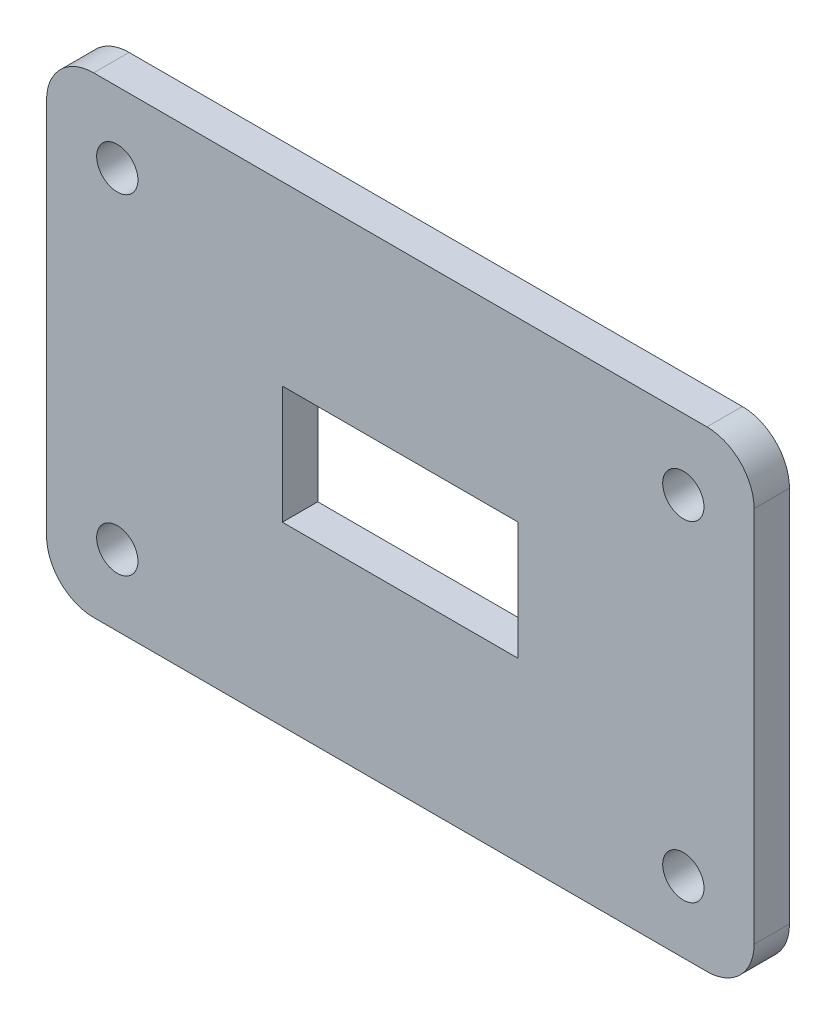
ISO-10303-21;
HEADER;
FILE_DESCRIPTION(('STEP AP214'),'2;1');
FILE_NAME('part.step','',(''),(''),'','','');
FILE_SCHEMA(('AUTOMOTIVE_DESIGN { 1 0 10303 214 1 1 1 1 }'));
ENDSEC;
DATA;
#1=APPLICATION_CONTEXT('core data for automotive mechanical design processes');
#2=APPLICATION_PROTOCOL_DEFINITION('international standard','automotive_design',2000,#1);
#3=PRODUCT_CONTEXT('',#1,'mechanical');
#4=PRODUCT('Part','Part','',(#3));
#5=PRODUCT_RELATED_PRODUCT_CATEGORY('part','',(#4));
#6=PRODUCT_DEFINITION_FORMATION('','',#4);
#7=PRODUCT_DEFINITION_CONTEXT('part definition',#1,'design');
#8=PRODUCT_DEFINITION('design','',#6,#7);
#9=PRODUCT_DEFINITION_SHAPE('','',#8);
#10=(LENGTH_UNIT() NAMED_UNIT(*) SI_UNIT(.MILLI.,.METRE.));
#11=(NAMED_UNIT(*) PLANE_ANGLE_UNIT() SI_UNIT($,.RADIAN.));
#12=(NAMED_UNIT(*) SI_UNIT($,.STERADIAN.) SOLID_ANGLE_UNIT());
#13=UNCERTAINTY_MEASURE_WITH_UNIT(LENGTH_MEASURE(1.E-05),#10,'distance_accuracy_value','');
#14=(GEOMETRIC_REPRESENTATION_CONTEXT(3) GLOBAL_UNCERTAINTY_ASSIGNED_CONTEXT((#13)) GLOBAL_UNIT_ASSIGNED_CONTEXT((#10,
#11,#12)) REPRESENTATION_CONTEXT('',''));
#15=CARTESIAN_POINT('',(0.,0.,0.));
#16=DIRECTION('',(0.,0.,1.));
#17=DIRECTION('',(1.,0.,0.));
#18=AXIS2_PLACEMENT_3D('',#15,#16,#17);
#19=CARTESIAN_POINT('',(-52.,-32.,6.));
#20=DIRECTION('',(0.,0.,-1.));
#21=DIRECTION('',(-1.,0.,0.));
#22=AXIS2_PLACEMENT_3D('',#19,#20,#21);
#23=CYLINDRICAL_SURFACE('',#22,7.99999999999999);
#24=CARTESIAN_POINT('',(-52.,-32.,0.));
#25=DIRECTION('',(0.,0.,1.));
#26=DIRECTION('',(1.,0.,0.));
#27=AXIS2_PLACEMENT_3D('',#24,#25,#26);
#28=CIRCLE('',#27,7.99999999999999);
#29=CARTESIAN_POINT('',(-60.,-32.,0.));
#30=VERTEX_POINT('',#29);
#31=CARTESIAN_POINT('',(-52.,-40.,0.));
#32=VERTEX_POINT('',#31);
#33=EDGE_CURVE('E220',#30,#32,#28,.T.);
#34=ORIENTED_EDGE('',*,*,#33,.T.);
#35=DIRECTION('',(0.,0.,-1.));
#36=VECTOR('',#35,1.);
#37=CARTESIAN_POINT('',(-52.,-40.,6.));
#38=LINE('',#37,#36);
#39=CARTESIAN_POINT('',(-52.,-40.,6.));
#40=VERTEX_POINT('',#39);
#41=EDGE_CURVE('E144',#40,#32,#38,.T.);
#42=ORIENTED_EDGE('',*,*,#41,.F.);
#43=CARTESIAN_POINT('',(-52.,-32.,6.));
#44=DIRECTION('',(0.,0.,1.));
#45=DIRECTION('',(1.,0.,0.));
#46=AXIS2_PLACEMENT_3D('',#43,#44,#45);
#47=CIRCLE('',#46,7.99999999999999);
#48=CARTESIAN_POINT('',(-60.,-32.,6.));
#49=VERTEX_POINT('',#48);
#50=EDGE_CURVE('E201',#49,#40,#47,.T.);
#51=ORIENTED_EDGE('',*,*,#50,.F.);
#52=DIRECTION('',(0.,0.,-1.));
#53=VECTOR('',#52,1.);
#54=CARTESIAN_POINT('',(-60.,-32.,6.));
#55=LINE('',#54,#53);
#56=EDGE_CURVE('E194',#49,#30,#55,.T.);
#57=ORIENTED_EDGE('',*,*,#56,.T.);
#58=EDGE_LOOP('',(#34,#42,#51,#57));
#59=FACE_BOUND('',#58,.T.);
#60=ADVANCED_FACE('F51',(#59),#23,.T.);
#61=CARTESIAN_POINT('',(-52.,-40.,6.));
#62=DIRECTION('',(0.,1.,0.));
#63=DIRECTION('',(0.,0.,1.));
#64=AXIS2_PLACEMENT_3D('',#61,#62,#63);
#65=PLANE('',#64);
#66=DIRECTION('',(1.,0.,0.));
#67=VECTOR('',#66,1.);
#68=CARTESIAN_POINT('',(-52.,-40.,0.));
#69=LINE('',#68,#67);
#70=CARTESIAN_POINT('',(52.,-40.,0.));
#71=VERTEX_POINT('',#70);
#72=EDGE_CURVE('E217',#32,#71,#69,.T.);
#73=ORIENTED_EDGE('',*,*,#72,.T.);
#74=DIRECTION('',(0.,0.,-1.));
#75=VECTOR('',#74,1.);
#76=CARTESIAN_POINT('',(52.,-40.,6.));
#77=LINE('',#76,#75);
#78=CARTESIAN_POINT('',(52.,-40.,6.));
#79=VERTEX_POINT('',#78);
#80=EDGE_CURVE('E170',#79,#71,#77,.T.);
#81=ORIENTED_EDGE('',*,*,#80,.F.);
#82=DIRECTION('',(1.,0.,0.));
#83=VECTOR('',#82,1.);
#84=CARTESIAN_POINT('',(-52.,-40.,6.));
#85=LINE('',#84,#83);
#86=EDGE_CURVE('E242',#40,#79,#85,.T.);
#87=ORIENTED_EDGE('',*,*,#86,.F.);
#88=ORIENTED_EDGE('',*,*,#41,.T.);
#89=EDGE_LOOP('',(#73,#81,#87,#88));
#90=FACE_BOUND('',#89,.T.);
#91=ADVANCED_FACE('F314',(#90),#65,.F.);
#92=CARTESIAN_POINT('',(52.,-32.,6.));
#93=DIRECTION('',(0.,0.,-1.));
#94=DIRECTION('',(-1.,0.,0.));
#95=AXIS2_PLACEMENT_3D('',#92,#93,#94);
#96=CYLINDRICAL_SURFACE('',#95,7.99999999999999);
#97=CARTESIAN_POINT('',(52.,-32.,0.));
#98=DIRECTION('',(0.,0.,1.));
#99=DIRECTION('',(1.,0.,0.));
#100=AXIS2_PLACEMENT_3D('',#97,#98,#99);
#101=CIRCLE('',#100,7.99999999999999);
#102=CARTESIAN_POINT('',(60.,-32.,0.));
#103=VERTEX_POINT('',#102);
#104=EDGE_CURVE('E214',#71,#103,#101,.T.);
#105=ORIENTED_EDGE('',*,*,#104,.T.);
#106=DIRECTION('',(0.,0.,-1.));
#107=VECTOR('',#106,1.);
#108=CARTESIAN_POINT('',(60.,-32.,6.));
#109=LINE('',#108,#107);
#110=CARTESIAN_POINT('',(60.,-32.,6.));
#111=VERTEX_POINT('',#110);
#112=EDGE_CURVE('E174',#111,#103,#109,.T.);
#113=ORIENTED_EDGE('',*,*,#112,.F.);
#114=CARTESIAN_POINT('',(52.,-32.,6.));
#115=DIRECTION('',(0.,0.,1.));
#116=DIRECTION('',(1.,0.,0.));
#117=AXIS2_PLACEMENT_3D('',#114,#115,#116);
#118=CIRCLE('',#117,7.99999999999999);
#119=EDGE_CURVE('E239',#79,#111,#118,.T.);
#120=ORIENTED_EDGE('',*,*,#119,.F.);
#121=ORIENTED_EDGE('',*,*,#80,.T.);
#122=EDGE_LOOP('',(#105,#113,#120,#121));
#123=FACE_BOUND('',#122,.T.);
#124=ADVANCED_FACE('F318',(#123),#96,.T.);
#125=CARTESIAN_POINT('',(60.,-32.,6.));
#126=DIRECTION('',(-1.,0.,0.));
#127=DIRECTION('',(0.,0.,1.));
#128=AXIS2_PLACEMENT_3D('',#125,#126,#127);
#129=PLANE('',#128);
#130=DIRECTION('',(0.,1.,0.));
#131=VECTOR('',#130,1.);
#132=CARTESIAN_POINT('',(60.,-32.,0.));
#133=LINE('',#132,#131);
#134=CARTESIAN_POINT('',(60.,32.,0.));
#135=VERTEX_POINT('',#134);
#136=EDGE_CURVE('E211',#103,#135,#133,.T.);
#137=ORIENTED_EDGE('',*,*,#136,.T.);
#138=DIRECTION('',(0.,0.,-1.));
#139=VECTOR('',#138,1.);
#140=CARTESIAN_POINT('',(60.,32.,6.));
#141=LINE('',#140,#139);
#142=CARTESIAN_POINT('',(60.,32.,6.));
#143=VERTEX_POINT('',#142);
#144=EDGE_CURVE('E178',#143,#135,#141,.T.);
#145=ORIENTED_EDGE('',*,*,#144,.F.);
#146=DIRECTION('',(0.,1.,0.));
#147=VECTOR('',#146,1.);
#148=CARTESIAN_POINT('',(60.,-32.,6.));
#149=LINE('',#148,#147);
#150=EDGE_CURVE('E236',#111,#143,#149,.T.);
#151=ORIENTED_EDGE('',*,*,#150,.F.);
#152=ORIENTED_EDGE('',*,*,#112,.T.);
#153=EDGE_LOOP('',(#137,#145,#151,#152));
#154=FACE_BOUND('',#153,.T.);
#155=ADVANCED_FACE('F352',(#154),#129,.F.);
#156=CARTESIAN_POINT('',(52.,32.,6.));
#157=DIRECTION('',(0.,0.,-1.));
#158=DIRECTION('',(-1.,0.,0.));
#159=AXIS2_PLACEMENT_3D('',#156,#157,#158);
#160=CYLINDRICAL_SURFACE('',#159,7.99999999999999);
#161=CARTESIAN_POINT('',(52.,32.,0.));
#162=DIRECTION('',(0.,0.,1.));
#163=DIRECTION('',(1.,0.,0.));
#164=AXIS2_PLACEMENT_3D('',#161,#162,#163);
#165=CIRCLE('',#164,7.99999999999999);
#166=CARTESIAN_POINT('',(52.,40.,0.));
#167=VERTEX_POINT('',#166);
#168=EDGE_CURVE('E208',#135,#167,#165,.T.);
#169=ORIENTED_EDGE('',*,*,#168,.T.);
#170=DIRECTION('',(0.,0.,-1.));
#171=VECTOR('',#170,1.);
#172=CARTESIAN_POINT('',(52.,40.,6.));
#173=LINE('',#172,#171);
#174=CARTESIAN_POINT('',(52.,40.,6.));
#175=VERTEX_POINT('',#174);
#176=EDGE_CURVE('E182',#175,#167,#173,.T.);
#177=ORIENTED_EDGE('',*,*,#176,.F.);
#178=CARTESIAN_POINT('',(52.,32.,6.));
#179=DIRECTION('',(0.,0.,1.));
#180=DIRECTION('',(1.,0.,0.));
#181=AXIS2_PLACEMENT_3D('',#178,#179,#180);
#182=CIRCLE('',#181,7.99999999999999);
#183=EDGE_CURVE('E233',#143,#175,#182,.T.);
#184=ORIENTED_EDGE('',*,*,#183,.F.);
#185=ORIENTED_EDGE('',*,*,#144,.T.);
#186=EDGE_LOOP('',(#169,#177,#184,#185));
#187=FACE_BOUND('',#186,.T.);
#188=ADVANCED_FACE('F348',(#187),#160,.T.);
#189=CARTESIAN_POINT('',(52.,40.,6.));
#190=DIRECTION('',(0.,-1.,0.));
#191=DIRECTION('',(0.,0.,-1.));
#192=AXIS2_PLACEMENT_3D('',#189,#190,#191);
#193=PLANE('',#192);
#194=DIRECTION('',(-1.,0.,0.));
#195=VECTOR('',#194,1.);
#196=CARTESIAN_POINT('',(52.,40.,0.));
#197=LINE('',#196,#195);
#198=CARTESIAN_POINT('',(-52.,40.,0.));
#199=VERTEX_POINT('',#198);
#200=EDGE_CURVE('E205',#167,#199,#197,.T.);
#201=ORIENTED_EDGE('',*,*,#200,.T.);
#202=DIRECTION('',(0.,0.,-1.));
#203=VECTOR('',#202,1.);
#204=CARTESIAN_POINT('',(-52.,40.,6.));
#205=LINE('',#204,#203);
#206=CARTESIAN_POINT('',(-52.,40.,6.));
#207=VERTEX_POINT('',#206);
#208=EDGE_CURVE('E186',#207,#199,#205,.T.);
#209=ORIENTED_EDGE('',*,*,#208,.F.);
#210=DIRECTION('',(-1.,0.,0.));
#211=VECTOR('',#210,1.);
#212=CARTESIAN_POINT('',(52.,40.,6.));
#213=LINE('',#212,#211);
#214=EDGE_CURVE('E230',#175,#207,#213,.T.);
#215=ORIENTED_EDGE('',*,*,#214,.F.);
#216=ORIENTED_EDGE('',*,*,#176,.T.);
#217=EDGE_LOOP('',(#201,#209,#215,#216));
#218=FACE_BOUND('',#217,.T.);
#219=ADVANCED_FACE('F343',(#218),#193,.F.);
#220=CARTESIAN_POINT('',(-52.,32.,6.));
#221=DIRECTION('',(0.,0.,-1.));
#222=DIRECTION('',(-1.,0.,0.));
#223=AXIS2_PLACEMENT_3D('',#220,#221,#222);
#224=CYLINDRICAL_SURFACE('',#223,7.99999999999999);
#225=CARTESIAN_POINT('',(-52.,32.,0.));
#226=DIRECTION('',(0.,0.,1.));
#227=DIRECTION('',(1.,0.,0.));
#228=AXIS2_PLACEMENT_3D('',#225,#226,#227);
#229=CIRCLE('',#228,7.99999999999999);
#230=CARTESIAN_POINT('',(-60.,32.,0.));
#231=VERTEX_POINT('',#230);
#232=EDGE_CURVE('E202',#199,#231,#229,.T.);
#233=ORIENTED_EDGE('',*,*,#232,.T.);
#234=DIRECTION('',(0.,0.,-1.));
#235=VECTOR('',#234,1.);
#236=CARTESIAN_POINT('',(-60.,32.,6.));
#237=LINE('',#236,#235);
#238=CARTESIAN_POINT('',(-60.,32.,6.));
#239=VERTEX_POINT('',#238);
#240=EDGE_CURVE('E190',#239,#231,#237,.T.);
#241=ORIENTED_EDGE('',*,*,#240,.F.);
#242=CARTESIAN_POINT('',(-52.,32.,6.));
#243=DIRECTION('',(0.,0.,1.));
#244=DIRECTION('',(1.,0.,0.));
#245=AXIS2_PLACEMENT_3D('',#242,#243,#244);
#246=CIRCLE('',#245,7.99999999999999);
#247=EDGE_CURVE('E227',#207,#239,#246,.T.);
#248=ORIENTED_EDGE('',*,*,#247,.F.);
#249=ORIENTED_EDGE('',*,*,#208,.T.);
#250=EDGE_LOOP('',(#233,#241,#248,#249));
#251=FACE_BOUND('',#250,.T.);
#252=ADVANCED_FACE('F338',(#251),#224,.T.);
#253=CARTESIAN_POINT('',(-60.,32.,6.));
#254=DIRECTION('',(1.,0.,0.));
#255=DIRECTION('',(0.,0.,-1.));
#256=AXIS2_PLACEMENT_3D('',#253,#254,#255);
#257=PLANE('',#256);
#258=DIRECTION('',(0.,-1.,0.));
#259=VECTOR('',#258,1.);
#260=CARTESIAN_POINT('',(-60.,32.,0.));
#261=LINE('',#260,#259);
#262=EDGE_CURVE('E199',#231,#30,#261,.T.);
#263=ORIENTED_EDGE('',*,*,#262,.T.);
#264=ORIENTED_EDGE('',*,*,#56,.F.);
#265=DIRECTION('',(0.,-1.,0.));
#266=VECTOR('',#265,1.);
#267=CARTESIAN_POINT('',(-60.,32.,6.));
#268=LINE('',#267,#266);
#269=EDGE_CURVE('E198',#239,#49,#268,.T.);
#270=ORIENTED_EDGE('',*,*,#269,.F.);
#271=ORIENTED_EDGE('',*,*,#240,.T.);
#272=EDGE_LOOP('',(#263,#264,#270,#271));
#273=FACE_BOUND('',#272,.T.);
#274=ADVANCED_FACE('F336',(#273),#257,.F.);
#275=CARTESIAN_POINT('',(-52.,-32.,6.));
#276=DIRECTION('',(0.,0.,1.));
#277=DIRECTION('',(1.,0.,0.));
#278=AXIS2_PLACEMENT_3D('',#275,#276,#277);
#279=PLANE('',#278);
#280=DIRECTION('',(0.,-1.,0.));
#281=VECTOR('',#280,1.);
#282=CARTESIAN_POINT('',(-20.,-32.,6.));
#283=LINE('',#282,#281);
#284=CARTESIAN_POINT('',(-20.,10.,6.00000000000001));
#285=VERTEX_POINT('',#284);
#286=CARTESIAN_POINT('',(-20.,-10.,6.));
#287=VERTEX_POINT('',#286);
#288=EDGE_CURVE('E151',#285,#287,#283,.T.);
#289=ORIENTED_EDGE('',*,*,#288,.F.);
#290=DIRECTION('',(-1.,0.,0.));
#291=VECTOR('',#290,1.);
#292=CARTESIAN_POINT('',(-52.,10.,6.));
#293=LINE('',#292,#291);
#294=CARTESIAN_POINT('',(20.,10.,6.00000000000001));
#295=VERTEX_POINT('',#294);
#296=EDGE_CURVE('E280',#295,#285,#293,.T.);
#297=ORIENTED_EDGE('',*,*,#296,.F.);
#298=DIRECTION('',(0.,1.,0.));
#299=VECTOR('',#298,1.);
#300=CARTESIAN_POINT('',(20.,-32.,6.));
#301=LINE('',#300,#299);
#302=CARTESIAN_POINT('',(20.,-10.,6.00000000000001));
#303=VERTEX_POINT('',#302);
#304=EDGE_CURVE('E283',#303,#295,#301,.T.);
#305=ORIENTED_EDGE('',*,*,#304,.F.);
#306=DIRECTION('',(1.,0.,0.));
#307=VECTOR('',#306,1.);
#308=CARTESIAN_POINT('',(-52.,-10.,6.));
#309=LINE('',#308,#307);
#310=EDGE_CURVE('E286',#287,#303,#309,.T.);
#311=ORIENTED_EDGE('',*,*,#310,.F.);
#312=EDGE_LOOP('',(#289,#297,#305,#311));
#313=FACE_BOUND('',#312,.T.);
#314=CARTESIAN_POINT('',(-48.,28.,6.));
#315=DIRECTION('',(0.,0.,1.));
#316=DIRECTION('',(1.,0.,0.));
#317=AXIS2_PLACEMENT_3D('',#314,#315,#316);
#318=CIRCLE('',#317,3.5);
#319=CARTESIAN_POINT('',(-44.5,28.,6.));
#320=VERTEX_POINT('',#319);
#321=EDGE_CURVE('E265',#320,#320,#318,.T.);
#322=ORIENTED_EDGE('',*,*,#321,.F.);
#323=EDGE_LOOP('',(#322));
#324=FACE_BOUND('',#323,.T.);
#325=CARTESIAN_POINT('',(48.,-28.,6.));
#326=DIRECTION('',(0.,0.,1.));
#327=DIRECTION('',(1.,0.,0.));
#328=AXIS2_PLACEMENT_3D('',#325,#326,#327);
#329=CIRCLE('',#328,3.5);
#330=CARTESIAN_POINT('',(51.5,-28.,6.));
#331=VERTEX_POINT('',#330);
#332=EDGE_CURVE('E256',#331,#331,#329,.T.);
#333=ORIENTED_EDGE('',*,*,#332,.F.);
#334=EDGE_LOOP('',(#333));
#335=FACE_BOUND('',#334,.T.);
#336=CARTESIAN_POINT('',(48.,28.,6.));
#337=DIRECTION('',(0.,0.,1.));
#338=DIRECTION('',(1.,0.,0.));
#339=AXIS2_PLACEMENT_3D('',#336,#337,#338);
#340=CIRCLE('',#339,3.5);
#341=CARTESIAN_POINT('',(51.5,28.,6.));
#342=VERTEX_POINT('',#341);
#343=EDGE_CURVE('E272',#342,#342,#340,.T.);
#344=ORIENTED_EDGE('',*,*,#343,.F.);
#345=EDGE_LOOP('',(#344));
#346=FACE_BOUND('',#345,.T.);
#347=CARTESIAN_POINT('',(-48.,-28.,6.));
#348=DIRECTION('',(0.,0.,1.));
#349=DIRECTION('',(1.,0.,0.));
#350=AXIS2_PLACEMENT_3D('',#347,#348,#349);
#351=CIRCLE('',#350,3.5);
#352=CARTESIAN_POINT('',(-44.5,-28.,6.));
#353=VERTEX_POINT('',#352);
#354=EDGE_CURVE('E224',#353,#353,#351,.T.);
#355=ORIENTED_EDGE('',*,*,#354,.F.);
#356=EDGE_LOOP('',(#355));
#357=FACE_BOUND('',#356,.T.);
#358=ORIENTED_EDGE('',*,*,#50,.T.);
#359=ORIENTED_EDGE('',*,*,#86,.T.);
#360=ORIENTED_EDGE('',*,*,#119,.T.);
#361=ORIENTED_EDGE('',*,*,#150,.T.);
#362=ORIENTED_EDGE('',*,*,#183,.T.);
#363=ORIENTED_EDGE('',*,*,#214,.T.);
#364=ORIENTED_EDGE('',*,*,#247,.T.);
#365=ORIENTED_EDGE('',*,*,#269,.T.);
#366=EDGE_LOOP('',(#358,#359,#360,#361,#362,#363,#364,#365));
#367=FACE_BOUND('',#366,.T.);
#368=ADVANCED_FACE('F298',(#313,#324,#335,#346,#357,#367),#279,.T.);
#369=CARTESIAN_POINT('',(-52.,-32.,0.));
#370=DIRECTION('',(0.,0.,1.));
#371=DIRECTION('',(1.,0.,0.));
#372=AXIS2_PLACEMENT_3D('',#369,#370,#371);
#373=PLANE('',#372);
#374=DIRECTION('',(-1.,0.,0.));
#375=VECTOR('',#374,1.);
#376=CARTESIAN_POINT('',(-52.,10.,0.));
#377=LINE('',#376,#375);
#378=CARTESIAN_POINT('',(20.,10.,0.));
#379=VERTEX_POINT('',#378);
#380=CARTESIAN_POINT('',(-20.,10.,0.));
#381=VERTEX_POINT('',#380);
#382=EDGE_CURVE('E60',#379,#381,#377,.T.);
#383=ORIENTED_EDGE('',*,*,#382,.T.);
#384=DIRECTION('',(0.,-1.,0.));
#385=VECTOR('',#384,1.);
#386=CARTESIAN_POINT('',(-20.,-32.,0.));
#387=LINE('',#386,#385);
#388=CARTESIAN_POINT('',(-20.,-10.,0.));
#389=VERTEX_POINT('',#388);
#390=EDGE_CURVE('E11',#381,#389,#387,.T.);
#391=ORIENTED_EDGE('',*,*,#390,.T.);
#392=DIRECTION('',(1.,0.,0.));
#393=VECTOR('',#392,1.);
#394=CARTESIAN_POINT('',(-52.,-10.,0.));
#395=LINE('',#394,#393);
#396=CARTESIAN_POINT('',(20.,-10.,0.));
#397=VERTEX_POINT('',#396);
#398=EDGE_CURVE('E138',#389,#397,#395,.T.);
#399=ORIENTED_EDGE('',*,*,#398,.T.);
#400=DIRECTION('',(0.,1.,0.));
#401=VECTOR('',#400,1.);
#402=CARTESIAN_POINT('',(20.,-32.,0.));
#403=LINE('',#402,#401);
#404=EDGE_CURVE('E143',#397,#379,#403,.T.);
#405=ORIENTED_EDGE('',*,*,#404,.T.);
#406=EDGE_LOOP('',(#383,#391,#399,#405));
#407=FACE_BOUND('',#406,.T.);
#408=CARTESIAN_POINT('',(-48.,28.,0.));
#409=DIRECTION('',(0.,0.,1.));
#410=DIRECTION('',(1.,0.,0.));
#411=AXIS2_PLACEMENT_3D('',#408,#409,#410);
#412=CIRCLE('',#411,3.5);
#413=CARTESIAN_POINT('',(-44.5,28.,0.));
#414=VERTEX_POINT('',#413);
#415=EDGE_CURVE('E252',#414,#414,#412,.T.);
#416=ORIENTED_EDGE('',*,*,#415,.T.);
#417=EDGE_LOOP('',(#416));
#418=FACE_BOUND('',#417,.T.);
#419=CARTESIAN_POINT('',(48.,-28.,0.));
#420=DIRECTION('',(0.,0.,1.));
#421=DIRECTION('',(1.,0.,0.));
#422=AXIS2_PLACEMENT_3D('',#419,#420,#421);
#423=CIRCLE('',#422,3.5);
#424=CARTESIAN_POINT('',(51.5,-28.,0.));
#425=VERTEX_POINT('',#424);
#426=EDGE_CURVE('E260',#425,#425,#423,.T.);
#427=ORIENTED_EDGE('',*,*,#426,.T.);
#428=EDGE_LOOP('',(#427));
#429=FACE_BOUND('',#428,.T.);
#430=CARTESIAN_POINT('',(48.,28.,0.));
#431=DIRECTION('',(0.,0.,1.));
#432=DIRECTION('',(1.,0.,0.));
#433=AXIS2_PLACEMENT_3D('',#430,#431,#432);
#434=CIRCLE('',#433,3.5);
#435=CARTESIAN_POINT('',(51.5,28.,0.));
#436=VERTEX_POINT('',#435);
#437=EDGE_CURVE('E261',#436,#436,#434,.T.);
#438=ORIENTED_EDGE('',*,*,#437,.T.);
#439=EDGE_LOOP('',(#438));
#440=FACE_BOUND('',#439,.T.);
#441=CARTESIAN_POINT('',(-48.,-28.,0.));
#442=DIRECTION('',(0.,0.,1.));
#443=DIRECTION('',(1.,0.,0.));
#444=AXIS2_PLACEMENT_3D('',#441,#442,#443);
#445=CIRCLE('',#444,3.5);
#446=CARTESIAN_POINT('',(-44.5,-28.,0.));
#447=VERTEX_POINT('',#446);
#448=EDGE_CURVE('E248',#447,#447,#445,.T.);
#449=ORIENTED_EDGE('',*,*,#448,.T.);
#450=EDGE_LOOP('',(#449));
#451=FACE_BOUND('',#450,.T.);
#452=ORIENTED_EDGE('',*,*,#33,.F.);
#453=ORIENTED_EDGE('',*,*,#262,.F.);
#454=ORIENTED_EDGE('',*,*,#232,.F.);
#455=ORIENTED_EDGE('',*,*,#200,.F.);
#456=ORIENTED_EDGE('',*,*,#168,.F.);
#457=ORIENTED_EDGE('',*,*,#136,.F.);
#458=ORIENTED_EDGE('',*,*,#104,.F.);
#459=ORIENTED_EDGE('',*,*,#72,.F.);
#460=EDGE_LOOP('',(#452,#453,#454,#455,#456,#457,#458,#459));
#461=FACE_BOUND('',#460,.T.);
#462=ADVANCED_FACE('F156',(#407,#418,#429,#440,#451,#461),#373,.F.);
#463=CARTESIAN_POINT('',(-48.,-28.,6.));
#464=DIRECTION('',(0.,0.,-1.));
#465=DIRECTION('',(-1.,0.,0.));
#466=AXIS2_PLACEMENT_3D('',#463,#464,#465);
#467=CYLINDRICAL_SURFACE('',#466,3.5);
#468=ORIENTED_EDGE('',*,*,#354,.T.);
#469=EDGE_LOOP('',(#468));
#470=FACE_BOUND('',#469,.T.);
#471=ORIENTED_EDGE('',*,*,#448,.F.);
#472=EDGE_LOOP('',(#471));
#473=FACE_BOUND('',#472,.T.);
#474=ADVANCED_FACE('F381',(#470,#473),#467,.F.);
#475=CARTESIAN_POINT('',(48.,28.,6.));
#476=DIRECTION('',(0.,0.,-1.));
#477=DIRECTION('',(-1.,0.,0.));
#478=AXIS2_PLACEMENT_3D('',#475,#476,#477);
#479=CYLINDRICAL_SURFACE('',#478,3.5);
#480=ORIENTED_EDGE('',*,*,#343,.T.);
#481=EDGE_LOOP('',(#480));
#482=FACE_BOUND('',#481,.T.);
#483=ORIENTED_EDGE('',*,*,#437,.F.);
#484=EDGE_LOOP('',(#483));
#485=FACE_BOUND('',#484,.T.);
#486=ADVANCED_FACE('F387',(#482,#485),#479,.F.);
#487=CARTESIAN_POINT('',(48.,-28.,6.));
#488=DIRECTION('',(0.,0.,-1.));
#489=DIRECTION('',(-1.,0.,0.));
#490=AXIS2_PLACEMENT_3D('',#487,#488,#489);
#491=CYLINDRICAL_SURFACE('',#490,3.5);
#492=ORIENTED_EDGE('',*,*,#332,.T.);
#493=EDGE_LOOP('',(#492));
#494=FACE_BOUND('',#493,.T.);
#495=ORIENTED_EDGE('',*,*,#426,.F.);
#496=EDGE_LOOP('',(#495));
#497=FACE_BOUND('',#496,.T.);
#498=ADVANCED_FACE('F390',(#494,#497),#491,.F.);
#499=CARTESIAN_POINT('',(-48.,28.,6.));
#500=DIRECTION('',(0.,0.,-1.));
#501=DIRECTION('',(-1.,0.,0.));
#502=AXIS2_PLACEMENT_3D('',#499,#500,#501);
#503=CYLINDRICAL_SURFACE('',#502,3.5);
#504=ORIENTED_EDGE('',*,*,#321,.T.);
#505=EDGE_LOOP('',(#504));
#506=FACE_BOUND('',#505,.T.);
#507=ORIENTED_EDGE('',*,*,#415,.F.);
#508=EDGE_LOOP('',(#507));
#509=FACE_BOUND('',#508,.T.);
#510=ADVANCED_FACE('F310',(#506,#509),#503,.F.);
#511=CARTESIAN_POINT('',(-20.,10.,-121.));
#512=DIRECTION('',(-1.,0.,0.));
#513=DIRECTION('',(0.,0.,1.));
#514=AXIS2_PLACEMENT_3D('',#511,#512,#513);
#515=PLANE('',#514);
#516=ORIENTED_EDGE('',*,*,#288,.T.);
#517=DIRECTION('',(0.,0.,1.));
#518=VECTOR('',#517,1.);
#519=CARTESIAN_POINT('',(-20.,-10.,-121.));
#520=LINE('',#519,#518);
#521=EDGE_CURVE('E67',#389,#287,#520,.T.);
#522=ORIENTED_EDGE('',*,*,#521,.F.);
#523=ORIENTED_EDGE('',*,*,#390,.F.);
#524=DIRECTION('',(0.,0.,1.));
#525=VECTOR('',#524,1.);
#526=CARTESIAN_POINT('',(-20.,10.,-121.));
#527=LINE('',#526,#525);
#528=EDGE_CURVE('E288',#381,#285,#527,.T.);
#529=ORIENTED_EDGE('',*,*,#528,.T.);
#530=EDGE_LOOP('',(#516,#522,#523,#529));
#531=FACE_BOUND('',#530,.T.);
#532=ADVANCED_FACE('F147',(#531),#515,.F.);
#533=CARTESIAN_POINT('',(20.,10.,-121.));
#534=DIRECTION('',(0.,1.,0.));
#535=DIRECTION('',(0.,0.,1.));
#536=AXIS2_PLACEMENT_3D('',#533,#534,#535);
#537=PLANE('',#536);
#538=ORIENTED_EDGE('',*,*,#296,.T.);
#539=ORIENTED_EDGE('',*,*,#528,.F.);
#540=ORIENTED_EDGE('',*,*,#382,.F.);
#541=DIRECTION('',(0.,0.,1.));
#542=VECTOR('',#541,1.);
#543=CARTESIAN_POINT('',(20.,10.,-121.));
#544=LINE('',#543,#542);
#545=EDGE_CURVE('E292',#379,#295,#544,.T.);
#546=ORIENTED_EDGE('',*,*,#545,.T.);
#547=EDGE_LOOP('',(#538,#539,#540,#546));
#548=FACE_BOUND('',#547,.T.);
#549=ADVANCED_FACE('F303',(#548),#537,.F.);
#550=CARTESIAN_POINT('',(20.,-10.,-121.));
#551=DIRECTION('',(1.,0.,0.));
#552=DIRECTION('',(0.,0.,-1.));
#553=AXIS2_PLACEMENT_3D('',#550,#551,#552);
#554=PLANE('',#553);
#555=ORIENTED_EDGE('',*,*,#304,.T.);
#556=ORIENTED_EDGE('',*,*,#545,.F.);
#557=ORIENTED_EDGE('',*,*,#404,.F.);
#558=DIRECTION('',(0.,0.,1.));
#559=VECTOR('',#558,1.);
#560=CARTESIAN_POINT('',(20.,-10.,-121.));
#561=LINE('',#560,#559);
#562=EDGE_CURVE('E72',#397,#303,#561,.T.);
#563=ORIENTED_EDGE('',*,*,#562,.T.);
#564=EDGE_LOOP('',(#555,#556,#557,#563));
#565=FACE_BOUND('',#564,.T.);
#566=ADVANCED_FACE('F302',(#565),#554,.F.);
#567=CARTESIAN_POINT('',(-20.,-10.,-121.));
#568=DIRECTION('',(0.,-1.,0.));
#569=DIRECTION('',(0.,0.,-1.));
#570=AXIS2_PLACEMENT_3D('',#567,#568,#569);
#571=PLANE('',#570);
#572=ORIENTED_EDGE('',*,*,#310,.T.);
#573=ORIENTED_EDGE('',*,*,#562,.F.);
#574=ORIENTED_EDGE('',*,*,#398,.F.);
#575=ORIENTED_EDGE('',*,*,#521,.T.);
#576=EDGE_LOOP('',(#572,#573,#574,#575));
#577=FACE_BOUND('',#576,.T.);
#578=ADVANCED_FACE('F139',(#577),#571,.F.);
#579=CLOSED_SHELL('',(#60,#91,#124,#155,#188,#219,#252,#274,#368,#462,#474,#486,#498,#510,#532,
#549,#566,#578));
#580=MANIFOLD_SOLID_BREP('B2',#579);
#581=ADVANCED_BREP_SHAPE_REPRESENTATION('',(#18,#580),#14);
#582=SHAPE_DEFINITION_REPRESENTATION(#9,#581);
ENDSEC;
END-ISO-10303-21;
